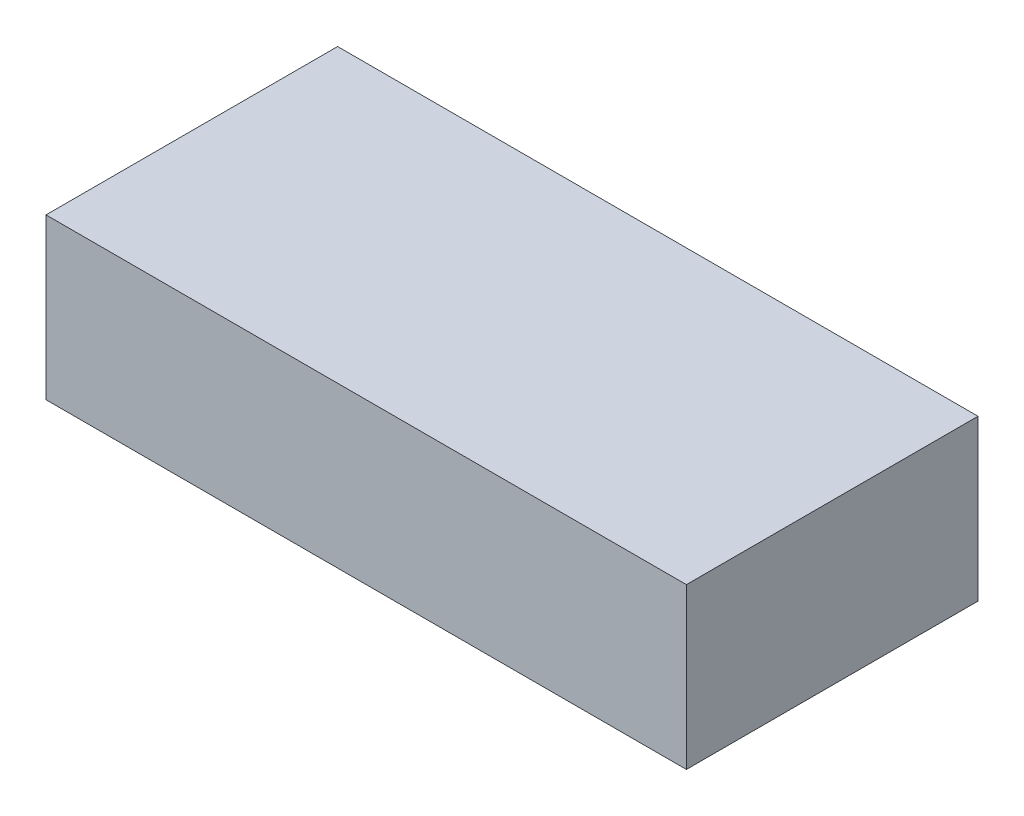
ISO-10303-21;
HEADER;
FILE_DESCRIPTION(('STEP AP214'),'2;1');
FILE_NAME('part.step','',(''),(''),'','','');
FILE_SCHEMA(('AUTOMOTIVE_DESIGN { 1 0 10303 214 1 1 1 1 }'));
ENDSEC;
DATA;
#1=APPLICATION_CONTEXT('core data for automotive mechanical design processes');
#2=APPLICATION_PROTOCOL_DEFINITION('international standard','automotive_design',2000,#1);
#3=PRODUCT_CONTEXT('',#1,'mechanical');
#4=PRODUCT('Part','Part','',(#3));
#5=PRODUCT_RELATED_PRODUCT_CATEGORY('part','',(#4));
#6=PRODUCT_DEFINITION_FORMATION('','',#4);
#7=PRODUCT_DEFINITION_CONTEXT('part definition',#1,'design');
#8=PRODUCT_DEFINITION('design','',#6,#7);
#9=PRODUCT_DEFINITION_SHAPE('','',#8);
#10=(LENGTH_UNIT() NAMED_UNIT(*) SI_UNIT(.MILLI.,.METRE.));
#11=(NAMED_UNIT(*) PLANE_ANGLE_UNIT() SI_UNIT($,.RADIAN.));
#12=(NAMED_UNIT(*) SI_UNIT($,.STERADIAN.) SOLID_ANGLE_UNIT());
#13=UNCERTAINTY_MEASURE_WITH_UNIT(LENGTH_MEASURE(1.E-05),#10,'distance_accuracy_value','');
#14=(GEOMETRIC_REPRESENTATION_CONTEXT(3) GLOBAL_UNCERTAINTY_ASSIGNED_CONTEXT((#13)) GLOBAL_UNIT_ASSIGNED_CONTEXT((#10,
#11,#12)) REPRESENTATION_CONTEXT('',''));
#15=CARTESIAN_POINT('',(0.,0.,0.));
#16=DIRECTION('',(0.,0.,1.));
#17=DIRECTION('',(1.,0.,0.));
#18=AXIS2_PLACEMENT_3D('',#15,#16,#17);
#19=CARTESIAN_POINT('',(28.,14.,12.75));
#20=DIRECTION('',(-1.,0.,0.));
#21=DIRECTION('',(0.,0.,1.));
#22=AXIS2_PLACEMENT_3D('',#19,#20,#21);
#23=PLANE('',#22);
#24=DIRECTION('',(0.,0.,-1.));
#25=VECTOR('',#24,1.);
#26=CARTESIAN_POINT('',(28.,0.,12.75));
#27=LINE('',#26,#25);
#28=CARTESIAN_POINT('',(28.,0.,12.75));
#29=VERTEX_POINT('',#28);
#30=CARTESIAN_POINT('',(28.,0.,-12.75));
#31=VERTEX_POINT('',#30);
#32=EDGE_CURVE('E95',#29,#31,#27,.T.);
#33=ORIENTED_EDGE('',*,*,#32,.T.);
#34=DIRECTION('',(0.,-1.,0.));
#35=VECTOR('',#34,1.);
#36=CARTESIAN_POINT('',(28.,14.,-12.75));
#37=LINE('',#36,#35);
#38=CARTESIAN_POINT('',(28.,14.,-12.75));
#39=VERTEX_POINT('',#38);
#40=EDGE_CURVE('E11',#39,#31,#37,.T.);
#41=ORIENTED_EDGE('',*,*,#40,.F.);
#42=DIRECTION('',(0.,0.,-1.));
#43=VECTOR('',#42,1.);
#44=CARTESIAN_POINT('',(28.,14.,12.75));
#45=LINE('',#44,#43);
#46=CARTESIAN_POINT('',(28.,14.,12.75));
#47=VERTEX_POINT('',#46);
#48=EDGE_CURVE('E83',#47,#39,#45,.T.);
#49=ORIENTED_EDGE('',*,*,#48,.F.);
#50=DIRECTION('',(0.,-1.,0.));
#51=VECTOR('',#50,1.);
#52=CARTESIAN_POINT('',(28.,14.,12.75));
#53=LINE('',#52,#51);
#54=EDGE_CURVE('E91',#47,#29,#53,.T.);
#55=ORIENTED_EDGE('',*,*,#54,.T.);
#56=EDGE_LOOP('',(#33,#41,#49,#55));
#57=FACE_BOUND('',#56,.T.);
#58=ADVANCED_FACE('F32',(#57),#23,.F.);
#59=CARTESIAN_POINT('',(-28.,14.,-12.75));
#60=DIRECTION('',(0.,0.,1.));
#61=DIRECTION('',(1.,0.,0.));
#62=AXIS2_PLACEMENT_3D('',#59,#60,#61);
#63=PLANE('',#62);
#64=DIRECTION('',(-1.,0.,0.));
#65=VECTOR('',#64,1.);
#66=CARTESIAN_POINT('',(-28.,0.,-12.75));
#67=LINE('',#66,#65);
#68=CARTESIAN_POINT('',(-28.,0.,-12.75));
#69=VERTEX_POINT('',#68);
#70=EDGE_CURVE('E87',#31,#69,#67,.T.);
#71=ORIENTED_EDGE('',*,*,#70,.T.);
#72=DIRECTION('',(0.,-1.,0.));
#73=VECTOR('',#72,1.);
#74=CARTESIAN_POINT('',(-28.,14.,-12.75));
#75=LINE('',#74,#73);
#76=CARTESIAN_POINT('',(-28.,14.,-12.75));
#77=VERTEX_POINT('',#76);
#78=EDGE_CURVE('E40',#77,#69,#75,.T.);
#79=ORIENTED_EDGE('',*,*,#78,.F.);
#80=DIRECTION('',(-1.,0.,0.));
#81=VECTOR('',#80,1.);
#82=CARTESIAN_POINT('',(-28.,14.,-12.75));
#83=LINE('',#82,#81);
#84=EDGE_CURVE('E78',#39,#77,#83,.T.);
#85=ORIENTED_EDGE('',*,*,#84,.F.);
#86=ORIENTED_EDGE('',*,*,#40,.T.);
#87=EDGE_LOOP('',(#71,#79,#85,#86));
#88=FACE_BOUND('',#87,.T.);
#89=ADVANCED_FACE('F86',(#88),#63,.F.);
#90=CARTESIAN_POINT('',(-28.,14.,12.75));
#91=DIRECTION('',(1.,0.,0.));
#92=DIRECTION('',(0.,0.,-1.));
#93=AXIS2_PLACEMENT_3D('',#90,#91,#92);
#94=PLANE('',#93);
#95=DIRECTION('',(0.,0.,1.));
#96=VECTOR('',#95,1.);
#97=CARTESIAN_POINT('',(-28.,0.,12.75));
#98=LINE('',#97,#96);
#99=CARTESIAN_POINT('',(-28.,0.,12.75));
#100=VERTEX_POINT('',#99);
#101=EDGE_CURVE('E65',#69,#100,#98,.T.);
#102=ORIENTED_EDGE('',*,*,#101,.T.);
#103=DIRECTION('',(0.,-1.,0.));
#104=VECTOR('',#103,1.);
#105=CARTESIAN_POINT('',(-28.,14.,12.75));
#106=LINE('',#105,#104);
#107=CARTESIAN_POINT('',(-28.,14.,12.75));
#108=VERTEX_POINT('',#107);
#109=EDGE_CURVE('E88',#108,#100,#106,.T.);
#110=ORIENTED_EDGE('',*,*,#109,.F.);
#111=DIRECTION('',(0.,0.,1.));
#112=VECTOR('',#111,1.);
#113=CARTESIAN_POINT('',(-28.,14.,12.75));
#114=LINE('',#113,#112);
#115=EDGE_CURVE('E81',#77,#108,#114,.T.);
#116=ORIENTED_EDGE('',*,*,#115,.F.);
#117=ORIENTED_EDGE('',*,*,#78,.T.);
#118=EDGE_LOOP('',(#102,#110,#116,#117));
#119=FACE_BOUND('',#118,.T.);
#120=ADVANCED_FACE('F89',(#119),#94,.F.);
#121=CARTESIAN_POINT('',(-28.,14.,12.75));
#122=DIRECTION('',(0.,0.,-1.));
#123=DIRECTION('',(-1.,0.,0.));
#124=AXIS2_PLACEMENT_3D('',#121,#122,#123);
#125=PLANE('',#124);
#126=DIRECTION('',(1.,0.,0.));
#127=VECTOR('',#126,1.);
#128=CARTESIAN_POINT('',(-28.,0.,12.75));
#129=LINE('',#128,#127);
#130=EDGE_CURVE('E71',#100,#29,#129,.T.);
#131=ORIENTED_EDGE('',*,*,#130,.T.);
#132=ORIENTED_EDGE('',*,*,#54,.F.);
#133=DIRECTION('',(1.,0.,0.));
#134=VECTOR('',#133,1.);
#135=CARTESIAN_POINT('',(-28.,14.,12.75));
#136=LINE('',#135,#134);
#137=EDGE_CURVE('E48',#108,#47,#136,.T.);
#138=ORIENTED_EDGE('',*,*,#137,.F.);
#139=ORIENTED_EDGE('',*,*,#109,.T.);
#140=EDGE_LOOP('',(#131,#132,#138,#139));
#141=FACE_BOUND('',#140,.T.);
#142=ADVANCED_FACE('F102',(#141),#125,.F.);
#143=CARTESIAN_POINT('',(0.,14.,0.));
#144=DIRECTION('',(0.,-1.,0.));
#145=DIRECTION('',(0.,0.,-1.));
#146=AXIS2_PLACEMENT_3D('',#143,#144,#145);
#147=PLANE('',#146);
#148=ORIENTED_EDGE('',*,*,#48,.T.);
#149=ORIENTED_EDGE('',*,*,#84,.T.);
#150=ORIENTED_EDGE('',*,*,#115,.T.);
#151=ORIENTED_EDGE('',*,*,#137,.T.);
#152=EDGE_LOOP('',(#148,#149,#150,#151));
#153=FACE_BOUND('',#152,.T.);
#154=ADVANCED_FACE('F79',(#153),#147,.F.);
#155=CARTESIAN_POINT('',(0.,0.,0.));
#156=DIRECTION('',(0.,-1.,0.));
#157=DIRECTION('',(0.,0.,-1.));
#158=AXIS2_PLACEMENT_3D('',#155,#156,#157);
#159=PLANE('',#158);
#160=ORIENTED_EDGE('',*,*,#32,.F.);
#161=ORIENTED_EDGE('',*,*,#130,.F.);
#162=ORIENTED_EDGE('',*,*,#101,.F.);
#163=ORIENTED_EDGE('',*,*,#70,.F.);
#164=EDGE_LOOP('',(#160,#161,#162,#163));
#165=FACE_BOUND('',#164,.T.);
#166=ADVANCED_FACE('F105',(#165),#159,.T.);
#167=CLOSED_SHELL('',(#58,#89,#120,#142,#154,#166));
#168=MANIFOLD_SOLID_BREP('B2',#167);
#169=ADVANCED_BREP_SHAPE_REPRESENTATION('',(#18,#168),#14);
#170=SHAPE_DEFINITION_REPRESENTATION(#9,#169);
ENDSEC;
END-ISO-10303-21;
